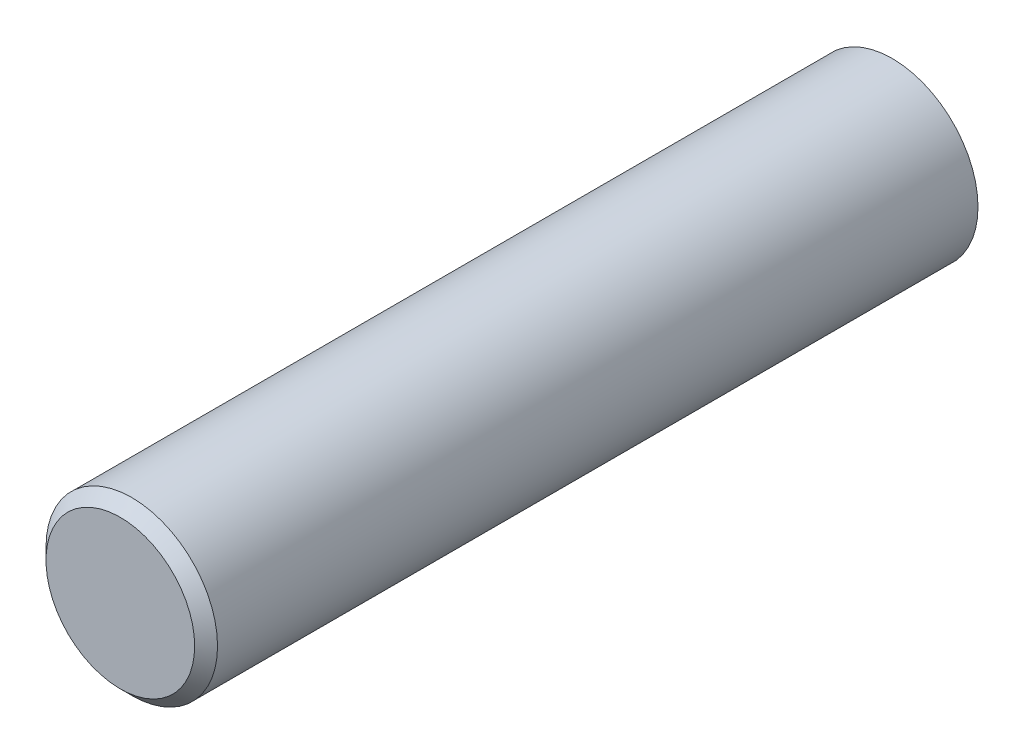
ISO-10303-21;
HEADER;
FILE_DESCRIPTION(('STEP AP214'),'2;1');
FILE_NAME('part.step','',(''),(''),'','','');
FILE_SCHEMA(('AUTOMOTIVE_DESIGN { 1 0 10303 214 1 1 1 1 }'));
ENDSEC;
DATA;
#1=APPLICATION_CONTEXT('core data for automotive mechanical design processes');
#2=APPLICATION_PROTOCOL_DEFINITION('international standard','automotive_design',2000,#1);
#3=PRODUCT_CONTEXT('',#1,'mechanical');
#4=PRODUCT('Part','Part','',(#3));
#5=PRODUCT_RELATED_PRODUCT_CATEGORY('part','',(#4));
#6=PRODUCT_DEFINITION_FORMATION('','',#4);
#7=PRODUCT_DEFINITION_CONTEXT('part definition',#1,'design');
#8=PRODUCT_DEFINITION('design','',#6,#7);
#9=PRODUCT_DEFINITION_SHAPE('','',#8);
#10=(LENGTH_UNIT() NAMED_UNIT(*) SI_UNIT(.MILLI.,.METRE.));
#11=(NAMED_UNIT(*) PLANE_ANGLE_UNIT() SI_UNIT($,.RADIAN.));
#12=(NAMED_UNIT(*) SI_UNIT($,.STERADIAN.) SOLID_ANGLE_UNIT());
#13=UNCERTAINTY_MEASURE_WITH_UNIT(LENGTH_MEASURE(1.E-05),#10,'distance_accuracy_value','');
#14=(GEOMETRIC_REPRESENTATION_CONTEXT(3) GLOBAL_UNCERTAINTY_ASSIGNED_CONTEXT((#13)) GLOBAL_UNIT_ASSIGNED_CONTEXT((#10,
#11,#12)) REPRESENTATION_CONTEXT('',''));
#15=CARTESIAN_POINT('',(0.,0.,0.));
#16=DIRECTION('',(0.,0.,1.));
#17=DIRECTION('',(1.,0.,0.));
#18=AXIS2_PLACEMENT_3D('',#15,#16,#17);
#19=CARTESIAN_POINT('',(0.,0.,6.75));
#20=DIRECTION('',(0.,0.,-1.));
#21=DIRECTION('',(-1.,0.,0.));
#22=AXIS2_PLACEMENT_3D('',#19,#20,#21);
#23=CYLINDRICAL_SURFACE('',#22,1.5);
#24=CARTESIAN_POINT('',(0.,0.,6.55));
#25=DIRECTION('',(0.,0.,1.));
#26=DIRECTION('',(1.,0.,0.));
#27=AXIS2_PLACEMENT_3D('',#24,#25,#26);
#28=CIRCLE('',#27,1.5);
#29=CARTESIAN_POINT('',(1.5,0.,6.55));
#30=VERTEX_POINT('',#29);
#31=EDGE_CURVE('E10',#30,#30,#28,.F.);
#32=ORIENTED_EDGE('',*,*,#31,.T.);
#33=EDGE_LOOP('',(#32));
#34=FACE_BOUND('',#33,.T.);
#35=CARTESIAN_POINT('',(0.,0.,-6.75));
#36=DIRECTION('',(0.,0.,1.));
#37=DIRECTION('',(1.,0.,0.));
#38=AXIS2_PLACEMENT_3D('',#35,#36,#37);
#39=CIRCLE('',#38,1.5);
#40=CARTESIAN_POINT('',(1.5,0.,-6.75));
#41=VERTEX_POINT('',#40);
#42=EDGE_CURVE('E53',#41,#41,#39,.T.);
#43=ORIENTED_EDGE('',*,*,#42,.T.);
#44=EDGE_LOOP('',(#43));
#45=FACE_BOUND('',#44,.T.);
#46=ADVANCED_FACE('F39',(#34,#45),#23,.T.);
#47=CARTESIAN_POINT('',(0.,0.,6.75));
#48=DIRECTION('',(0.,0.,1.));
#49=DIRECTION('',(1.,0.,0.));
#50=AXIS2_PLACEMENT_3D('',#47,#48,#49);
#51=PLANE('',#50);
#52=CARTESIAN_POINT('',(0.,0.,6.75));
#53=DIRECTION('',(0.,0.,1.));
#54=DIRECTION('',(1.,0.,0.));
#55=AXIS2_PLACEMENT_3D('',#52,#53,#54);
#56=CIRCLE('',#55,1.3);
#57=CARTESIAN_POINT('',(1.3,0.,6.75));
#58=VERTEX_POINT('',#57);
#59=EDGE_CURVE('E48',#58,#58,#56,.T.);
#60=ORIENTED_EDGE('',*,*,#59,.T.);
#61=EDGE_LOOP('',(#60));
#62=FACE_BOUND('',#61,.T.);
#63=ADVANCED_FACE('F64',(#62),#51,.T.);
#64=CARTESIAN_POINT('',(0.,0.,-6.75));
#65=DIRECTION('',(0.,0.,1.));
#66=DIRECTION('',(1.,0.,0.));
#67=AXIS2_PLACEMENT_3D('',#64,#65,#66);
#68=PLANE('',#67);
#69=ORIENTED_EDGE('',*,*,#42,.F.);
#70=EDGE_LOOP('',(#69));
#71=FACE_BOUND('',#70,.T.);
#72=ADVANCED_FACE('F62',(#71),#68,.F.);
#73=CARTESIAN_POINT('',(0.,0.,6.75));
#74=DIRECTION('',(0.,0.,-1.));
#75=DIRECTION('',(-1.,0.,0.));
#76=AXIS2_PLACEMENT_3D('',#73,#74,#75);
#77=CONICAL_SURFACE('',#76,1.3,0.785398163397445);
#78=ORIENTED_EDGE('',*,*,#31,.F.);
#79=EDGE_LOOP('',(#78));
#80=FACE_BOUND('',#79,.T.);
#81=ORIENTED_EDGE('',*,*,#59,.F.);
#82=EDGE_LOOP('',(#81));
#83=FACE_BOUND('',#82,.T.);
#84=ADVANCED_FACE('F42',(#80,#83),#77,.T.);
#85=CLOSED_SHELL('',(#46,#63,#72,#84));
#86=MANIFOLD_SOLID_BREP('B2',#85);
#87=ADVANCED_BREP_SHAPE_REPRESENTATION('',(#18,#86),#14);
#88=SHAPE_DEFINITION_REPRESENTATION(#9,#87);
ENDSEC;
END-ISO-10303-21;
